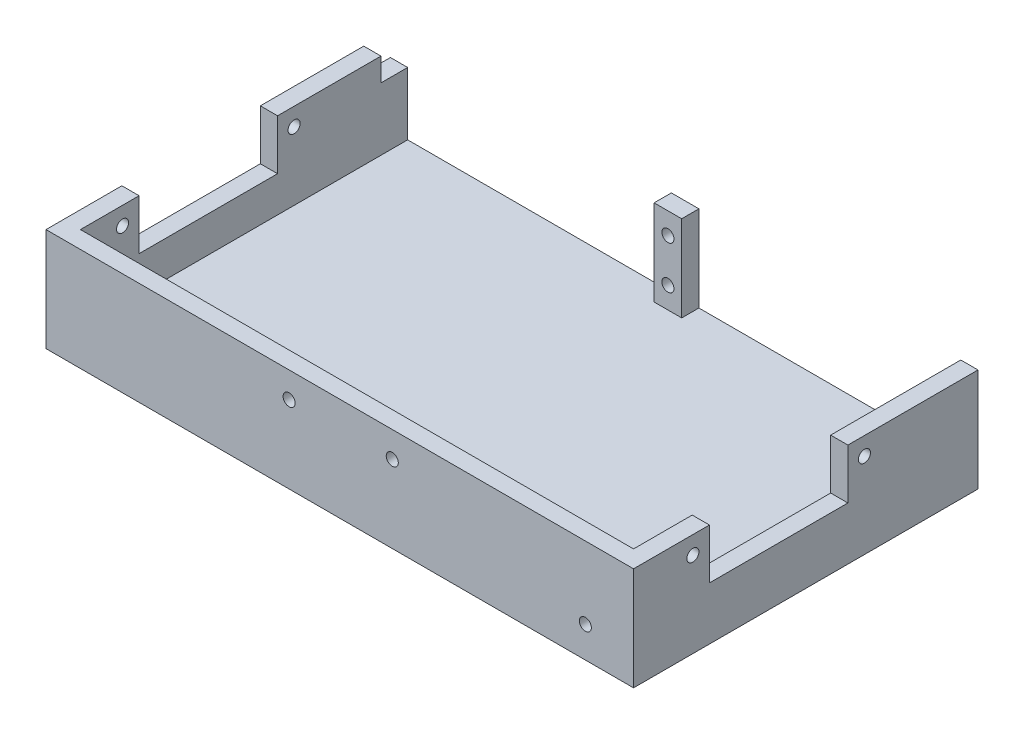
ISO-10303-21;
HEADER;
FILE_DESCRIPTION(('STEP AP214'),'2;1');
FILE_NAME('part.step','',(''),(''),'','','');
FILE_SCHEMA(('AUTOMOTIVE_DESIGN { 1 0 10303 214 1 1 1 1 }'));
ENDSEC;
DATA;
#1=APPLICATION_CONTEXT('core data for automotive mechanical design processes');
#2=APPLICATION_PROTOCOL_DEFINITION('international standard','automotive_design',2000,#1);
#3=PRODUCT_CONTEXT('',#1,'mechanical');
#4=PRODUCT('Part','Part','',(#3));
#5=PRODUCT_RELATED_PRODUCT_CATEGORY('part','',(#4));
#6=PRODUCT_DEFINITION_FORMATION('','',#4);
#7=PRODUCT_DEFINITION_CONTEXT('part definition',#1,'design');
#8=PRODUCT_DEFINITION('design','',#6,#7);
#9=PRODUCT_DEFINITION_SHAPE('','',#8);
#10=(LENGTH_UNIT() NAMED_UNIT(*) SI_UNIT(.MILLI.,.METRE.));
#11=(NAMED_UNIT(*) PLANE_ANGLE_UNIT() SI_UNIT($,.RADIAN.));
#12=(NAMED_UNIT(*) SI_UNIT($,.STERADIAN.) SOLID_ANGLE_UNIT());
#13=UNCERTAINTY_MEASURE_WITH_UNIT(LENGTH_MEASURE(1.E-05),#10,'distance_accuracy_value','');
#14=(GEOMETRIC_REPRESENTATION_CONTEXT(3) GLOBAL_UNCERTAINTY_ASSIGNED_CONTEXT((#13)) GLOBAL_UNIT_ASSIGNED_CONTEXT((#10,
#11,#12)) REPRESENTATION_CONTEXT('',''));
#15=CARTESIAN_POINT('',(0.,0.,0.));
#16=DIRECTION('',(0.,0.,1.));
#17=DIRECTION('',(1.,0.,0.));
#18=AXIS2_PLACEMENT_3D('',#15,#16,#17);
#19=CARTESIAN_POINT('',(0.,29.94,0.));
#20=DIRECTION('',(0.,1.,0.));
#21=DIRECTION('',(0.,0.,1.));
#22=AXIS2_PLACEMENT_3D('',#19,#20,#21);
#23=PLANE('',#22);
#24=DIRECTION('',(1.,0.,0.));
#25=VECTOR('',#24,1.);
#26=CARTESIAN_POINT('',(0.,29.94,64.439595486949));
#27=LINE('',#26,#25);
#28=CARTESIAN_POINT('',(-78.83991424,29.94,64.439595486949));
#29=VERTEX_POINT('',#28);
#30=CARTESIAN_POINT('',(-73.83991424,29.94,64.439595486949));
#31=VERTEX_POINT('',#30);
#32=EDGE_CURVE('E44',#29,#31,#27,.T.);
#33=ORIENTED_EDGE('',*,*,#32,.F.);
#34=DIRECTION('',(0.,0.,1.));
#35=VECTOR('',#34,1.);
#36=CARTESIAN_POINT('',(-78.83991424,29.94,0.));
#37=LINE('',#36,#35);
#38=CARTESIAN_POINT('',(-78.83991424,29.94,86.464595486949));
#39=VERTEX_POINT('',#38);
#40=EDGE_CURVE('E203',#29,#39,#37,.T.);
#41=ORIENTED_EDGE('',*,*,#40,.T.);
#42=DIRECTION('',(1.,0.,0.));
#43=VECTOR('',#42,1.);
#44=CARTESIAN_POINT('',(0.,29.94,86.464595486949));
#45=LINE('',#44,#43);
#46=CARTESIAN_POINT('',(91.74008576,29.94,86.464595486949));
#47=VERTEX_POINT('',#46);
#48=EDGE_CURVE('E235',#39,#47,#45,.T.);
#49=ORIENTED_EDGE('',*,*,#48,.T.);
#50=DIRECTION('',(0.,0.,-1.));
#51=VECTOR('',#50,1.);
#52=CARTESIAN_POINT('',(91.74008576,29.94,0.));
#53=LINE('',#52,#51);
#54=CARTESIAN_POINT('',(91.74008576,29.94,64.439595486949));
#55=VERTEX_POINT('',#54);
#56=EDGE_CURVE('E238',#47,#55,#53,.T.);
#57=ORIENTED_EDGE('',*,*,#56,.T.);
#58=CARTESIAN_POINT('',(86.74008576,29.94,64.439595486949));
#59=VERTEX_POINT('',#58);
#60=EDGE_CURVE('E207',#59,#55,#27,.T.);
#61=ORIENTED_EDGE('',*,*,#60,.F.);
#62=DIRECTION('',(0.,0.,1.));
#63=VECTOR('',#62,1.);
#64=CARTESIAN_POINT('',(86.74008576,29.94,0.));
#65=LINE('',#64,#63);
#66=CARTESIAN_POINT('',(86.74008576,29.94,81.464595486949));
#67=VERTEX_POINT('',#66);
#68=EDGE_CURVE('E231',#59,#67,#65,.T.);
#69=ORIENTED_EDGE('',*,*,#68,.T.);
#70=DIRECTION('',(-1.,0.,0.));
#71=VECTOR('',#70,1.);
#72=CARTESIAN_POINT('',(86.74008576,29.94,81.464595486949));
#73=LINE('',#72,#71);
#74=CARTESIAN_POINT('',(-73.83991424,29.94,81.464595486949));
#75=VERTEX_POINT('',#74);
#76=EDGE_CURVE('E396',#67,#75,#73,.T.);
#77=ORIENTED_EDGE('',*,*,#76,.T.);
#78=DIRECTION('',(0.,0.,1.));
#79=VECTOR('',#78,1.);
#80=CARTESIAN_POINT('',(-73.83991424,29.94,0.));
#81=LINE('',#80,#79);
#82=EDGE_CURVE('E206',#31,#75,#81,.T.);
#83=ORIENTED_EDGE('',*,*,#82,.F.);
#84=EDGE_LOOP('',(#33,#41,#49,#57,#61,#69,#77,#83));
#85=FACE_BOUND('',#84,.T.);
#86=ADVANCED_FACE('F35',(#85),#23,.T.);
#87=DIRECTION('',(-1.,0.,0.));
#88=VECTOR('',#87,1.);
#89=CARTESIAN_POINT('',(0.,29.94,24.239595486949));
#90=LINE('',#89,#88);
#91=CARTESIAN_POINT('',(91.74008576,29.94,24.239595486949));
#92=VERTEX_POINT('',#91);
#93=CARTESIAN_POINT('',(86.74008576,29.94,24.239595486949));
#94=VERTEX_POINT('',#93);
#95=EDGE_CURVE('E270',#92,#94,#90,.T.);
#96=ORIENTED_EDGE('',*,*,#95,.F.);
#97=CARTESIAN_POINT('',(91.74008576,29.94,-13.535404513051));
#98=VERTEX_POINT('',#97);
#99=EDGE_CURVE('E237',#92,#98,#53,.T.);
#100=ORIENTED_EDGE('',*,*,#99,.T.);
#101=DIRECTION('',(-1.,0.,0.));
#102=VECTOR('',#101,1.);
#103=CARTESIAN_POINT('',(0.,29.94,-13.535404513051));
#104=LINE('',#103,#102);
#105=CARTESIAN_POINT('',(86.74008576,29.94,-13.535404513051));
#106=VERTEX_POINT('',#105);
#107=EDGE_CURVE('E228',#98,#106,#104,.T.);
#108=ORIENTED_EDGE('',*,*,#107,.T.);
#109=EDGE_CURVE('E232',#106,#94,#65,.T.);
#110=ORIENTED_EDGE('',*,*,#109,.T.);
#111=EDGE_LOOP('',(#96,#100,#108,#110));
#112=FACE_BOUND('',#111,.T.);
#113=ADVANCED_FACE('F454',(#112),#23,.T.);
#114=CARTESIAN_POINT('',(0.,5.,0.));
#115=DIRECTION('',(0.,1.,0.));
#116=DIRECTION('',(0.,0.,1.));
#117=AXIS2_PLACEMENT_3D('',#114,#115,#116);
#118=PLANE('',#117);
#119=DIRECTION('',(1.,0.,0.));
#120=VECTOR('',#119,1.);
#121=CARTESIAN_POINT('',(10.7150857590685,5.,-8.53540451305102));
#122=LINE('',#121,#120);
#123=CARTESIAN_POINT('',(2.71508575906845,5.,-8.53540451305102));
#124=VERTEX_POINT('',#123);
#125=CARTESIAN_POINT('',(10.7150857590685,5.,-8.53540451305102));
#126=VERTEX_POINT('',#125);
#127=EDGE_CURVE('E379',#124,#126,#122,.T.);
#128=ORIENTED_EDGE('',*,*,#127,.F.);
#129=DIRECTION('',(0.,0.,1.));
#130=VECTOR('',#129,1.);
#131=CARTESIAN_POINT('',(2.71508575906845,5.,-8.53540451305102));
#132=LINE('',#131,#130);
#133=CARTESIAN_POINT('',(2.71508575906845,5.,-13.535404513051));
#134=VERTEX_POINT('',#133);
#135=EDGE_CURVE('E366',#134,#124,#132,.T.);
#136=ORIENTED_EDGE('',*,*,#135,.F.);
#137=DIRECTION('',(-1.,0.,0.));
#138=VECTOR('',#137,1.);
#139=CARTESIAN_POINT('',(-78.83991424,5.,-13.535404513051));
#140=LINE('',#139,#138);
#141=CARTESIAN_POINT('',(-73.83991424,5.,-13.535404513051));
#142=VERTEX_POINT('',#141);
#143=EDGE_CURVE('E250',#134,#142,#140,.T.);
#144=ORIENTED_EDGE('',*,*,#143,.T.);
#145=DIRECTION('',(0.,0.,1.));
#146=VECTOR('',#145,1.);
#147=CARTESIAN_POINT('',(-73.83991424,5.,0.));
#148=LINE('',#147,#146);
#149=CARTESIAN_POINT('',(-73.83991424,5.,81.464595486949));
#150=VERTEX_POINT('',#149);
#151=EDGE_CURVE('E222',#142,#150,#148,.T.);
#152=ORIENTED_EDGE('',*,*,#151,.T.);
#153=DIRECTION('',(-1.,0.,0.));
#154=VECTOR('',#153,1.);
#155=CARTESIAN_POINT('',(86.74008576,5.,81.464595486949));
#156=LINE('',#155,#154);
#157=CARTESIAN_POINT('',(86.74008576,5.,81.464595486949));
#158=VERTEX_POINT('',#157);
#159=EDGE_CURVE('E395',#158,#150,#156,.T.);
#160=ORIENTED_EDGE('',*,*,#159,.F.);
#161=DIRECTION('',(0.,0.,1.));
#162=VECTOR('',#161,1.);
#163=CARTESIAN_POINT('',(86.74008576,5.,0.));
#164=LINE('',#163,#162);
#165=CARTESIAN_POINT('',(86.74008576,5.,-13.535404513051));
#166=VERTEX_POINT('',#165);
#167=EDGE_CURVE('E227',#166,#158,#164,.T.);
#168=ORIENTED_EDGE('',*,*,#167,.F.);
#169=CARTESIAN_POINT('',(10.7150857590685,5.,-13.535404513051));
#170=VERTEX_POINT('',#169);
#171=EDGE_CURVE('E247',#166,#170,#140,.T.);
#172=ORIENTED_EDGE('',*,*,#171,.T.);
#173=DIRECTION('',(0.,0.,-1.));
#174=VECTOR('',#173,1.);
#175=CARTESIAN_POINT('',(10.7150857590685,5.,-13.535404513051));
#176=LINE('',#175,#174);
#177=EDGE_CURVE('E370',#126,#170,#176,.T.);
#178=ORIENTED_EDGE('',*,*,#177,.F.);
#179=EDGE_LOOP('',(#128,#136,#144,#152,#160,#168,#172,#178));
#180=FACE_BOUND('',#179,.T.);
#181=ADVANCED_FACE('F413',(#180),#118,.T.);
#182=CARTESIAN_POINT('',(86.74008576,29.94,0.));
#183=DIRECTION('',(1.,0.,0.));
#184=DIRECTION('',(0.,0.,-1.));
#185=AXIS2_PLACEMENT_3D('',#182,#183,#184);
#186=PLANE('',#185);
#187=CARTESIAN_POINT('',(86.74008576,24.7500000000059,19.4395955400394));
#188=DIRECTION('',(1.,0.,0.));
#189=DIRECTION('',(0.,0.,-1.));
#190=AXIS2_PLACEMENT_3D('',#187,#188,#189);
#191=CIRCLE('',#190,1.75);
#192=CARTESIAN_POINT('',(86.74008576,24.7500000000059,17.6895955400394));
#193=VERTEX_POINT('',#192);
#194=EDGE_CURVE('E305',#193,#193,#191,.T.);
#195=ORIENTED_EDGE('',*,*,#194,.T.);
#196=EDGE_LOOP('',(#195));
#197=FACE_BOUND('',#196,.T.);
#198=CARTESIAN_POINT('',(86.74008576,24.7500000000052,69.2395955400386));
#199=DIRECTION('',(1.,0.,0.));
#200=DIRECTION('',(0.,0.,-1.));
#201=AXIS2_PLACEMENT_3D('',#198,#199,#200);
#202=CIRCLE('',#201,1.75);
#203=CARTESIAN_POINT('',(86.74008576,24.7500000000052,67.4895955400386));
#204=VERTEX_POINT('',#203);
#205=EDGE_CURVE('E198',#204,#204,#202,.T.);
#206=ORIENTED_EDGE('',*,*,#205,.T.);
#207=EDGE_LOOP('',(#206));
#208=FACE_BOUND('',#207,.T.);
#209=ORIENTED_EDGE('',*,*,#68,.F.);
#210=DIRECTION('',(0.,-1.,0.));
#211=VECTOR('',#210,1.);
#212=CARTESIAN_POINT('',(86.74008576,29.94,64.439595486949));
#213=LINE('',#212,#211);
#214=CARTESIAN_POINT('',(86.74008576,15.375,64.439595486949));
#215=VERTEX_POINT('',#214);
#216=EDGE_CURVE('E333',#59,#215,#213,.T.);
#217=ORIENTED_EDGE('',*,*,#216,.T.);
#218=DIRECTION('',(0.,0.,-1.));
#219=VECTOR('',#218,1.);
#220=CARTESIAN_POINT('',(86.74008576,15.375,0.));
#221=LINE('',#220,#219);
#222=CARTESIAN_POINT('',(86.74008576,15.375,24.239595486949));
#223=VERTEX_POINT('',#222);
#224=EDGE_CURVE('E338',#215,#223,#221,.T.);
#225=ORIENTED_EDGE('',*,*,#224,.T.);
#226=DIRECTION('',(0.,1.,0.));
#227=VECTOR('',#226,1.);
#228=CARTESIAN_POINT('',(86.74008576,29.94,24.239595486949));
#229=LINE('',#228,#227);
#230=EDGE_CURVE('E325',#223,#94,#229,.T.);
#231=ORIENTED_EDGE('',*,*,#230,.T.);
#232=ORIENTED_EDGE('',*,*,#109,.F.);
#233=DIRECTION('',(0.,-1.,0.));
#234=VECTOR('',#233,1.);
#235=CARTESIAN_POINT('',(86.74008576,29.94,-13.535404513051));
#236=LINE('',#235,#234);
#237=EDGE_CURVE('E241',#106,#166,#236,.T.);
#238=ORIENTED_EDGE('',*,*,#237,.T.);
#239=ORIENTED_EDGE('',*,*,#167,.T.);
#240=DIRECTION('',(0.,-1.,0.));
#241=VECTOR('',#240,1.);
#242=CARTESIAN_POINT('',(86.74008576,29.94,81.464595486949));
#243=LINE('',#242,#241);
#244=EDGE_CURVE('E225',#67,#158,#243,.T.);
#245=ORIENTED_EDGE('',*,*,#244,.F.);
#246=EDGE_LOOP('',(#209,#217,#225,#231,#232,#238,#239,#245));
#247=FACE_BOUND('',#246,.T.);
#248=ADVANCED_FACE('F409',(#197,#208,#247),#186,.F.);
#249=CARTESIAN_POINT('',(-73.83991424,29.94,0.));
#250=DIRECTION('',(1.,0.,0.));
#251=DIRECTION('',(0.,0.,-1.));
#252=AXIS2_PLACEMENT_3D('',#249,#250,#251);
#253=PLANE('',#252);
#254=CARTESIAN_POINT('',(-73.83991424,24.7500000000059,19.4395955400394));
#255=DIRECTION('',(1.,0.,0.));
#256=DIRECTION('',(0.,0.,-1.));
#257=AXIS2_PLACEMENT_3D('',#254,#255,#256);
#258=CIRCLE('',#257,1.75);
#259=CARTESIAN_POINT('',(-73.83991424,24.7500000000059,17.6895955400394));
#260=VERTEX_POINT('',#259);
#261=EDGE_CURVE('E280',#260,#260,#258,.T.);
#262=ORIENTED_EDGE('',*,*,#261,.F.);
#263=EDGE_LOOP('',(#262));
#264=FACE_BOUND('',#263,.T.);
#265=CARTESIAN_POINT('',(-73.83991424,24.7500000000052,69.2395955400386));
#266=DIRECTION('',(1.,0.,0.));
#267=DIRECTION('',(0.,0.,-1.));
#268=AXIS2_PLACEMENT_3D('',#265,#266,#267);
#269=CIRCLE('',#268,1.75);
#270=CARTESIAN_POINT('',(-73.83991424,24.7500000000052,67.4895955400386));
#271=VERTEX_POINT('',#270);
#272=EDGE_CURVE('E275',#271,#271,#269,.T.);
#273=ORIENTED_EDGE('',*,*,#272,.F.);
#274=EDGE_LOOP('',(#273));
#275=FACE_BOUND('',#274,.T.);
#276=DIRECTION('',(0.,-1.,0.));
#277=VECTOR('',#276,1.);
#278=CARTESIAN_POINT('',(-73.83991424,29.94,64.439595486949));
#279=LINE('',#278,#277);
#280=CARTESIAN_POINT('',(-73.83991424,15.375,64.439595486949));
#281=VERTEX_POINT('',#280);
#282=EDGE_CURVE('E331',#31,#281,#279,.T.);
#283=ORIENTED_EDGE('',*,*,#282,.F.);
#284=ORIENTED_EDGE('',*,*,#82,.T.);
#285=DIRECTION('',(0.,-1.,0.));
#286=VECTOR('',#285,1.);
#287=CARTESIAN_POINT('',(-73.83991424,29.94,81.464595486949));
#288=LINE('',#287,#286);
#289=EDGE_CURVE('E398',#75,#150,#288,.T.);
#290=ORIENTED_EDGE('',*,*,#289,.T.);
#291=ORIENTED_EDGE('',*,*,#151,.F.);
#292=DIRECTION('',(0.,-1.,0.));
#293=VECTOR('',#292,1.);
#294=CARTESIAN_POINT('',(-73.83991424,29.94,-13.535404513051));
#295=LINE('',#294,#293);
#296=CARTESIAN_POINT('',(-73.83991424,23.2,-13.535404513051));
#297=VERTEX_POINT('',#296);
#298=EDGE_CURVE('E217',#297,#142,#295,.T.);
#299=ORIENTED_EDGE('',*,*,#298,.F.);
#300=DIRECTION('',(0.,0.,-1.));
#301=VECTOR('',#300,1.);
#302=CARTESIAN_POINT('',(-73.83991424,23.2,0.));
#303=LINE('',#302,#301);
#304=CARTESIAN_POINT('',(-73.83991424,23.2,-5.78540451305102));
#305=VERTEX_POINT('',#304);
#306=EDGE_CURVE('E352',#305,#297,#303,.T.);
#307=ORIENTED_EDGE('',*,*,#306,.F.);
#308=DIRECTION('',(0.,-1.,0.));
#309=VECTOR('',#308,1.);
#310=CARTESIAN_POINT('',(-73.83991424,29.94,-5.78540451305102));
#311=LINE('',#310,#309);
#312=CARTESIAN_POINT('',(-73.83991424,29.94,-5.78540451305102));
#313=VERTEX_POINT('',#312);
#314=EDGE_CURVE('E349',#313,#305,#311,.T.);
#315=ORIENTED_EDGE('',*,*,#314,.F.);
#316=CARTESIAN_POINT('',(-73.83991424,29.94,24.239595486949));
#317=VERTEX_POINT('',#316);
#318=EDGE_CURVE('E214',#313,#317,#81,.T.);
#319=ORIENTED_EDGE('',*,*,#318,.T.);
#320=DIRECTION('',(0.,1.,0.));
#321=VECTOR('',#320,1.);
#322=CARTESIAN_POINT('',(-73.83991424,29.94,24.239595486949));
#323=LINE('',#322,#321);
#324=CARTESIAN_POINT('',(-73.83991424,15.375,24.239595486949));
#325=VERTEX_POINT('',#324);
#326=EDGE_CURVE('E52',#325,#317,#323,.T.);
#327=ORIENTED_EDGE('',*,*,#326,.F.);
#328=DIRECTION('',(0.,0.,-1.));
#329=VECTOR('',#328,1.);
#330=CARTESIAN_POINT('',(-73.83991424,15.375,0.));
#331=LINE('',#330,#329);
#332=EDGE_CURVE('E336',#281,#325,#331,.T.);
#333=ORIENTED_EDGE('',*,*,#332,.F.);
#334=EDGE_LOOP('',(#283,#284,#290,#291,#299,#307,#315,#319,#327,#333));
#335=FACE_BOUND('',#334,.T.);
#336=ADVANCED_FACE('F437',(#264,#275,#335),#253,.T.);
#337=CARTESIAN_POINT('',(-78.83991424,5.,-13.535404513051));
#338=DIRECTION('',(1.,0.,0.));
#339=DIRECTION('',(0.,0.,-1.));
#340=AXIS2_PLACEMENT_3D('',#337,#338,#339);
#341=PLANE('',#340);
#342=CARTESIAN_POINT('',(-78.83991424,24.7500000000059,19.4395955400394));
#343=DIRECTION('',(-1.,0.,0.));
#344=DIRECTION('',(0.,0.,1.));
#345=AXIS2_PLACEMENT_3D('',#342,#343,#344);
#346=CIRCLE('',#345,1.75);
#347=CARTESIAN_POINT('',(-78.83991424,24.7500000000059,21.1895955400394));
#348=VERTEX_POINT('',#347);
#349=EDGE_CURVE('E281',#348,#348,#346,.T.);
#350=ORIENTED_EDGE('',*,*,#349,.F.);
#351=EDGE_LOOP('',(#350));
#352=FACE_BOUND('',#351,.T.);
#353=CARTESIAN_POINT('',(-78.83991424,24.7500000000052,69.2395955400386));
#354=DIRECTION('',(-1.,0.,0.));
#355=DIRECTION('',(0.,0.,1.));
#356=AXIS2_PLACEMENT_3D('',#353,#354,#355);
#357=CIRCLE('',#356,1.75);
#358=CARTESIAN_POINT('',(-78.83991424,24.7500000000052,70.9895955400386));
#359=VERTEX_POINT('',#358);
#360=EDGE_CURVE('E276',#359,#359,#357,.T.);
#361=ORIENTED_EDGE('',*,*,#360,.F.);
#362=EDGE_LOOP('',(#361));
#363=FACE_BOUND('',#362,.T.);
#364=ORIENTED_EDGE('',*,*,#40,.F.);
#365=DIRECTION('',(0.,1.,0.));
#366=VECTOR('',#365,1.);
#367=CARTESIAN_POINT('',(-78.83991424,15.375,64.439595486949));
#368=LINE('',#367,#366);
#369=CARTESIAN_POINT('',(-78.83991424,15.375,64.439595486949));
#370=VERTEX_POINT('',#369);
#371=EDGE_CURVE('E187',#370,#29,#368,.T.);
#372=ORIENTED_EDGE('',*,*,#371,.F.);
#373=DIRECTION('',(0.,0.,1.));
#374=VECTOR('',#373,1.);
#375=CARTESIAN_POINT('',(-78.83991424,15.375,24.239595486949));
#376=LINE('',#375,#374);
#377=CARTESIAN_POINT('',(-78.83991424,15.375,24.239595486949));
#378=VERTEX_POINT('',#377);
#379=EDGE_CURVE('E316',#378,#370,#376,.T.);
#380=ORIENTED_EDGE('',*,*,#379,.F.);
#381=DIRECTION('',(0.,-1.,0.));
#382=VECTOR('',#381,1.);
#383=CARTESIAN_POINT('',(-78.83991424,29.94,24.239595486949));
#384=LINE('',#383,#382);
#385=CARTESIAN_POINT('',(-78.83991424,29.94,24.239595486949));
#386=VERTEX_POINT('',#385);
#387=EDGE_CURVE('E197',#386,#378,#384,.T.);
#388=ORIENTED_EDGE('',*,*,#387,.F.);
#389=CARTESIAN_POINT('',(-78.83991424,29.94,-5.78540451305102));
#390=VERTEX_POINT('',#389);
#391=EDGE_CURVE('E213',#390,#386,#37,.T.);
#392=ORIENTED_EDGE('',*,*,#391,.F.);
#393=DIRECTION('',(0.,1.,0.));
#394=VECTOR('',#393,1.);
#395=CARTESIAN_POINT('',(-78.83991424,23.2,-5.78540451305102));
#396=LINE('',#395,#394);
#397=CARTESIAN_POINT('',(-78.83991424,23.2,-5.78540451305102));
#398=VERTEX_POINT('',#397);
#399=EDGE_CURVE('E344',#398,#390,#396,.T.);
#400=ORIENTED_EDGE('',*,*,#399,.F.);
#401=DIRECTION('',(0.,0.,1.));
#402=VECTOR('',#401,1.);
#403=CARTESIAN_POINT('',(-78.83991424,23.2,-13.535404513051));
#404=LINE('',#403,#402);
#405=CARTESIAN_POINT('',(-78.83991424,23.2,-13.535404513051));
#406=VERTEX_POINT('',#405);
#407=EDGE_CURVE('E341',#406,#398,#404,.T.);
#408=ORIENTED_EDGE('',*,*,#407,.F.);
#409=DIRECTION('',(0.,-1.,0.));
#410=VECTOR('',#409,1.);
#411=CARTESIAN_POINT('',(-78.83991424,5.,-13.535404513051));
#412=LINE('',#411,#410);
#413=CARTESIAN_POINT('',(-78.83991424,0.,-13.535404513051));
#414=VERTEX_POINT('',#413);
#415=EDGE_CURVE('E249',#406,#414,#412,.T.);
#416=ORIENTED_EDGE('',*,*,#415,.T.);
#417=DIRECTION('',(0.,0.,1.));
#418=VECTOR('',#417,1.);
#419=CARTESIAN_POINT('',(-78.83991424,0.,-13.535404513051));
#420=LINE('',#419,#418);
#421=CARTESIAN_POINT('',(-78.83991424,0.,86.464595486949));
#422=VERTEX_POINT('',#421);
#423=EDGE_CURVE('E246',#414,#422,#420,.T.);
#424=ORIENTED_EDGE('',*,*,#423,.T.);
#425=DIRECTION('',(0.,-1.,0.));
#426=VECTOR('',#425,1.);
#427=CARTESIAN_POINT('',(-78.83991424,5.,86.464595486949));
#428=LINE('',#427,#426);
#429=EDGE_CURVE('E212',#39,#422,#428,.T.);
#430=ORIENTED_EDGE('',*,*,#429,.F.);
#431=EDGE_LOOP('',(#364,#372,#380,#388,#392,#400,#408,#416,#424,#430));
#432=FACE_BOUND('',#431,.T.);
#433=ADVANCED_FACE('F37',(#352,#363,#432),#341,.F.);
#434=CARTESIAN_POINT('',(-78.83991424,5.,86.464595486949));
#435=DIRECTION('',(0.,0.,-1.));
#436=DIRECTION('',(-1.,0.,0.));
#437=AXIS2_PLACEMENT_3D('',#434,#435,#436);
#438=PLANE('',#437);
#439=CARTESIAN_POINT('',(-8.25207946889377,22.44,86.464595486949));
#440=DIRECTION('',(0.,0.,1.));
#441=DIRECTION('',(1.,0.,0.));
#442=AXIS2_PLACEMENT_3D('',#439,#440,#441);
#443=CIRCLE('',#442,1.75);
#444=CARTESIAN_POINT('',(-6.50207946889376,22.44,86.464595486949));
#445=VERTEX_POINT('',#444);
#446=EDGE_CURVE('E287',#445,#445,#443,.T.);
#447=ORIENTED_EDGE('',*,*,#446,.F.);
#448=EDGE_LOOP('',(#447));
#449=FACE_BOUND('',#448,.T.);
#450=CARTESIAN_POINT('',(77.74008576,9.,86.464595486949));
#451=DIRECTION('',(0.,0.,1.));
#452=DIRECTION('',(1.,0.,0.));
#453=AXIS2_PLACEMENT_3D('',#450,#451,#452);
#454=CIRCLE('',#453,1.75);
#455=CARTESIAN_POINT('',(79.49008576,9.,86.464595486949));
#456=VERTEX_POINT('',#455);
#457=EDGE_CURVE('E292',#456,#456,#454,.T.);
#458=ORIENTED_EDGE('',*,*,#457,.F.);
#459=EDGE_LOOP('',(#458));
#460=FACE_BOUND('',#459,.T.);
#461=CARTESIAN_POINT('',(21.6879205311062,22.44,86.464595486949));
#462=DIRECTION('',(0.,0.,1.));
#463=DIRECTION('',(1.,0.,0.));
#464=AXIS2_PLACEMENT_3D('',#461,#462,#463);
#465=CIRCLE('',#464,1.75);
#466=CARTESIAN_POINT('',(23.4379205311062,22.44,86.464595486949));
#467=VERTEX_POINT('',#466);
#468=EDGE_CURVE('E284',#467,#467,#465,.T.);
#469=ORIENTED_EDGE('',*,*,#468,.F.);
#470=EDGE_LOOP('',(#469));
#471=FACE_BOUND('',#470,.T.);
#472=DIRECTION('',(1.,0.,0.));
#473=VECTOR('',#472,1.);
#474=CARTESIAN_POINT('',(-78.83991424,0.,86.464595486949));
#475=LINE('',#474,#473);
#476=CARTESIAN_POINT('',(91.74008576,0.,86.464595486949));
#477=VERTEX_POINT('',#476);
#478=EDGE_CURVE('E252',#422,#477,#475,.T.);
#479=ORIENTED_EDGE('',*,*,#478,.T.);
#480=DIRECTION('',(0.,-1.,0.));
#481=VECTOR('',#480,1.);
#482=CARTESIAN_POINT('',(91.74008576,5.,86.464595486949));
#483=LINE('',#482,#481);
#484=EDGE_CURVE('E263',#47,#477,#483,.T.);
#485=ORIENTED_EDGE('',*,*,#484,.F.);
#486=ORIENTED_EDGE('',*,*,#48,.F.);
#487=ORIENTED_EDGE('',*,*,#429,.T.);
#488=EDGE_LOOP('',(#479,#485,#486,#487));
#489=FACE_BOUND('',#488,.T.);
#490=ADVANCED_FACE('F510',(#449,#460,#471,#489),#438,.F.);
#491=CARTESIAN_POINT('',(91.74008576,5.,-13.535404513051));
#492=DIRECTION('',(-1.,0.,0.));
#493=DIRECTION('',(0.,0.,1.));
#494=AXIS2_PLACEMENT_3D('',#491,#492,#493);
#495=PLANE('',#494);
#496=CARTESIAN_POINT('',(91.74008576,24.7500000000059,19.4395955400394));
#497=DIRECTION('',(-1.,0.,0.));
#498=DIRECTION('',(0.,0.,1.));
#499=AXIS2_PLACEMENT_3D('',#496,#497,#498);
#500=CIRCLE('',#499,1.75);
#501=CARTESIAN_POINT('',(91.74008576,24.7500000000059,21.1895955400394));
#502=VERTEX_POINT('',#501);
#503=EDGE_CURVE('E277',#502,#502,#500,.T.);
#504=ORIENTED_EDGE('',*,*,#503,.T.);
#505=EDGE_LOOP('',(#504));
#506=FACE_BOUND('',#505,.T.);
#507=CARTESIAN_POINT('',(91.74008576,24.7500000000052,69.2395955400386));
#508=DIRECTION('',(-1.,0.,0.));
#509=DIRECTION('',(0.,0.,1.));
#510=AXIS2_PLACEMENT_3D('',#507,#508,#509);
#511=CIRCLE('',#510,1.75);
#512=CARTESIAN_POINT('',(91.74008576,24.7500000000052,70.9895955400386));
#513=VERTEX_POINT('',#512);
#514=EDGE_CURVE('E272',#513,#513,#511,.T.);
#515=ORIENTED_EDGE('',*,*,#514,.T.);
#516=EDGE_LOOP('',(#515));
#517=FACE_BOUND('',#516,.T.);
#518=DIRECTION('',(0.,0.,1.));
#519=VECTOR('',#518,1.);
#520=CARTESIAN_POINT('',(91.74008576,15.375,-13.535404513051));
#521=LINE('',#520,#519);
#522=CARTESIAN_POINT('',(91.74008576,15.375,24.239595486949));
#523=VERTEX_POINT('',#522);
#524=CARTESIAN_POINT('',(91.74008576,15.375,64.439595486949));
#525=VERTEX_POINT('',#524);
#526=EDGE_CURVE('E11',#523,#525,#521,.T.);
#527=ORIENTED_EDGE('',*,*,#526,.T.);
#528=DIRECTION('',(0.,1.,0.));
#529=VECTOR('',#528,1.);
#530=CARTESIAN_POINT('',(91.74008576,5.,64.439595486949));
#531=LINE('',#530,#529);
#532=EDGE_CURVE('E328',#525,#55,#531,.T.);
#533=ORIENTED_EDGE('',*,*,#532,.T.);
#534=ORIENTED_EDGE('',*,*,#56,.F.);
#535=ORIENTED_EDGE('',*,*,#484,.T.);
#536=DIRECTION('',(0.,0.,-1.));
#537=VECTOR('',#536,1.);
#538=CARTESIAN_POINT('',(91.74008576,0.,-13.535404513051));
#539=LINE('',#538,#537);
#540=CARTESIAN_POINT('',(91.74008576,0.,-13.535404513051));
#541=VERTEX_POINT('',#540);
#542=EDGE_CURVE('E254',#477,#541,#539,.T.);
#543=ORIENTED_EDGE('',*,*,#542,.T.);
#544=DIRECTION('',(0.,-1.,0.));
#545=VECTOR('',#544,1.);
#546=CARTESIAN_POINT('',(91.74008576,5.,-13.535404513051));
#547=LINE('',#546,#545);
#548=EDGE_CURVE('E260',#98,#541,#547,.T.);
#549=ORIENTED_EDGE('',*,*,#548,.F.);
#550=ORIENTED_EDGE('',*,*,#99,.F.);
#551=DIRECTION('',(0.,-1.,0.));
#552=VECTOR('',#551,1.);
#553=CARTESIAN_POINT('',(91.74008576,5.,24.239595486949));
#554=LINE('',#553,#552);
#555=EDGE_CURVE('E60',#92,#523,#554,.T.);
#556=ORIENTED_EDGE('',*,*,#555,.T.);
#557=EDGE_LOOP('',(#527,#533,#534,#535,#543,#549,#550,#556));
#558=FACE_BOUND('',#557,.T.);
#559=ADVANCED_FACE('F447',(#506,#517,#558),#495,.F.);
#560=CARTESIAN_POINT('',(-78.83991424,5.,-13.535404513051));
#561=DIRECTION('',(0.,0.,1.));
#562=DIRECTION('',(1.,0.,0.));
#563=AXIS2_PLACEMENT_3D('',#560,#561,#562);
#564=PLANE('',#563);
#565=CARTESIAN_POINT('',(6.71508575906846,23.705,-13.535404513051));
#566=DIRECTION('',(0.,0.,1.));
#567=DIRECTION('',(1.,0.,0.));
#568=AXIS2_PLACEMENT_3D('',#565,#566,#567);
#569=CIRCLE('',#568,1.75);
#570=CARTESIAN_POINT('',(8.46508575906846,23.705,-13.535404513051));
#571=VERTEX_POINT('',#570);
#572=EDGE_CURVE('E357',#571,#571,#569,.T.);
#573=ORIENTED_EDGE('',*,*,#572,.T.);
#574=EDGE_LOOP('',(#573));
#575=FACE_BOUND('',#574,.T.);
#576=CARTESIAN_POINT('',(6.71508575906846,11.235,-13.535404513051));
#577=DIRECTION('',(0.,0.,1.));
#578=DIRECTION('',(1.,0.,0.));
#579=AXIS2_PLACEMENT_3D('',#576,#577,#578);
#580=CIRCLE('',#579,1.75);
#581=CARTESIAN_POINT('',(8.46508575906846,11.235,-13.535404513051));
#582=VERTEX_POINT('',#581);
#583=EDGE_CURVE('E363',#582,#582,#580,.T.);
#584=ORIENTED_EDGE('',*,*,#583,.T.);
#585=EDGE_LOOP('',(#584));
#586=FACE_BOUND('',#585,.T.);
#587=ORIENTED_EDGE('',*,*,#415,.F.);
#588=DIRECTION('',(-1.,0.,0.));
#589=VECTOR('',#588,1.);
#590=CARTESIAN_POINT('',(-68.83991424,23.2,-13.535404513051));
#591=LINE('',#590,#589);
#592=EDGE_CURVE('E346',#297,#406,#591,.T.);
#593=ORIENTED_EDGE('',*,*,#592,.F.);
#594=ORIENTED_EDGE('',*,*,#298,.T.);
#595=ORIENTED_EDGE('',*,*,#143,.F.);
#596=DIRECTION('',(0.,-1.,0.));
#597=VECTOR('',#596,1.);
#598=CARTESIAN_POINT('',(2.71508575906845,29.94,-13.535404513051));
#599=LINE('',#598,#597);
#600=CARTESIAN_POINT('',(2.71508575906845,29.94,-13.535404513051));
#601=VERTEX_POINT('',#600);
#602=EDGE_CURVE('E392',#601,#134,#599,.T.);
#603=ORIENTED_EDGE('',*,*,#602,.F.);
#604=DIRECTION('',(-1.,0.,0.));
#605=VECTOR('',#604,1.);
#606=CARTESIAN_POINT('',(6.45008576,29.94,-13.535404513051));
#607=LINE('',#606,#605);
#608=CARTESIAN_POINT('',(10.7150857590685,29.94,-13.535404513051));
#609=VERTEX_POINT('',#608);
#610=EDGE_CURVE('E367',#609,#601,#607,.T.);
#611=ORIENTED_EDGE('',*,*,#610,.F.);
#612=DIRECTION('',(0.,-1.,0.));
#613=VECTOR('',#612,1.);
#614=CARTESIAN_POINT('',(10.7150857590685,29.94,-13.535404513051));
#615=LINE('',#614,#613);
#616=EDGE_CURVE('E376',#609,#170,#615,.T.);
#617=ORIENTED_EDGE('',*,*,#616,.T.);
#618=ORIENTED_EDGE('',*,*,#171,.F.);
#619=ORIENTED_EDGE('',*,*,#237,.F.);
#620=ORIENTED_EDGE('',*,*,#107,.F.);
#621=ORIENTED_EDGE('',*,*,#548,.T.);
#622=DIRECTION('',(-1.,0.,0.));
#623=VECTOR('',#622,1.);
#624=CARTESIAN_POINT('',(-78.83991424,0.,-13.535404513051));
#625=LINE('',#624,#623);
#626=EDGE_CURVE('E256',#541,#414,#625,.T.);
#627=ORIENTED_EDGE('',*,*,#626,.T.);
#628=EDGE_LOOP('',(#587,#593,#594,#595,#603,#611,#617,#618,#619,#620,#621,#627));
#629=FACE_BOUND('',#628,.T.);
#630=ADVANCED_FACE('F416',(#575,#586,#629),#564,.F.);
#631=CARTESIAN_POINT('',(0.,0.,0.));
#632=DIRECTION('',(0.,1.,0.));
#633=DIRECTION('',(0.,0.,1.));
#634=AXIS2_PLACEMENT_3D('',#631,#632,#633);
#635=PLANE('',#634);
#636=ORIENTED_EDGE('',*,*,#423,.F.);
#637=ORIENTED_EDGE('',*,*,#626,.F.);
#638=ORIENTED_EDGE('',*,*,#542,.F.);
#639=ORIENTED_EDGE('',*,*,#478,.F.);
#640=EDGE_LOOP('',(#636,#637,#638,#639));
#641=FACE_BOUND('',#640,.T.);
#642=ADVANCED_FACE('F460',(#641),#635,.F.);
#643=EDGE_CURVE('E269',#317,#386,#90,.T.);
#644=ORIENTED_EDGE('',*,*,#643,.F.);
#645=ORIENTED_EDGE('',*,*,#318,.F.);
#646=DIRECTION('',(1.,0.,0.));
#647=VECTOR('',#646,1.);
#648=CARTESIAN_POINT('',(0.,29.94,-5.78540451305102));
#649=LINE('',#648,#647);
#650=EDGE_CURVE('E267',#390,#313,#649,.T.);
#651=ORIENTED_EDGE('',*,*,#650,.F.);
#652=ORIENTED_EDGE('',*,*,#391,.T.);
#653=EDGE_LOOP('',(#644,#645,#651,#652));
#654=FACE_BOUND('',#653,.T.);
#655=ADVANCED_FACE('F472',(#654),#23,.T.);
#656=CARTESIAN_POINT('',(86.74008576,29.94,81.464595486949));
#657=DIRECTION('',(0.,0.,1.));
#658=DIRECTION('',(1.,0.,0.));
#659=AXIS2_PLACEMENT_3D('',#656,#657,#658);
#660=PLANE('',#659);
#661=CARTESIAN_POINT('',(-8.25207946889377,22.44,81.464595486949));
#662=DIRECTION('',(0.,0.,1.));
#663=DIRECTION('',(1.,0.,0.));
#664=AXIS2_PLACEMENT_3D('',#661,#662,#663);
#665=CIRCLE('',#664,1.75);
#666=CARTESIAN_POINT('',(-6.50207946889376,22.44,81.464595486949));
#667=VERTEX_POINT('',#666);
#668=EDGE_CURVE('E39',#667,#667,#665,.T.);
#669=ORIENTED_EDGE('',*,*,#668,.T.);
#670=EDGE_LOOP('',(#669));
#671=FACE_BOUND('',#670,.T.);
#672=CARTESIAN_POINT('',(77.74008576,9.,81.464595486949));
#673=DIRECTION('',(0.,0.,1.));
#674=DIRECTION('',(1.,0.,0.));
#675=AXIS2_PLACEMENT_3D('',#672,#673,#674);
#676=CIRCLE('',#675,1.75);
#677=CARTESIAN_POINT('',(79.49008576,9.,81.464595486949));
#678=VERTEX_POINT('',#677);
#679=EDGE_CURVE('E285',#678,#678,#676,.T.);
#680=ORIENTED_EDGE('',*,*,#679,.T.);
#681=EDGE_LOOP('',(#680));
#682=FACE_BOUND('',#681,.T.);
#683=CARTESIAN_POINT('',(21.6879205311062,22.44,81.464595486949));
#684=DIRECTION('',(0.,0.,1.));
#685=DIRECTION('',(1.,0.,0.));
#686=AXIS2_PLACEMENT_3D('',#683,#684,#685);
#687=CIRCLE('',#686,1.75);
#688=CARTESIAN_POINT('',(23.4379205311062,22.44,81.464595486949));
#689=VERTEX_POINT('',#688);
#690=EDGE_CURVE('E282',#689,#689,#687,.T.);
#691=ORIENTED_EDGE('',*,*,#690,.T.);
#692=EDGE_LOOP('',(#691));
#693=FACE_BOUND('',#692,.T.);
#694=ORIENTED_EDGE('',*,*,#159,.T.);
#695=ORIENTED_EDGE('',*,*,#289,.F.);
#696=ORIENTED_EDGE('',*,*,#76,.F.);
#697=ORIENTED_EDGE('',*,*,#244,.T.);
#698=EDGE_LOOP('',(#694,#695,#696,#697));
#699=FACE_BOUND('',#698,.T.);
#700=ADVANCED_FACE('F405',(#671,#682,#693,#699),#660,.F.);
#701=CARTESIAN_POINT('',(2.71508575906845,29.94,-8.53540451305102));
#702=DIRECTION('',(1.,0.,0.));
#703=DIRECTION('',(0.,0.,-1.));
#704=AXIS2_PLACEMENT_3D('',#701,#702,#703);
#705=PLANE('',#704);
#706=ORIENTED_EDGE('',*,*,#135,.T.);
#707=DIRECTION('',(0.,-1.,0.));
#708=VECTOR('',#707,1.);
#709=CARTESIAN_POINT('',(2.71508575906845,29.94,-8.53540451305102));
#710=LINE('',#709,#708);
#711=CARTESIAN_POINT('',(2.71508575906845,29.94,-8.53540451305102));
#712=VERTEX_POINT('',#711);
#713=EDGE_CURVE('E389',#712,#124,#710,.T.);
#714=ORIENTED_EDGE('',*,*,#713,.F.);
#715=DIRECTION('',(0.,0.,1.));
#716=VECTOR('',#715,1.);
#717=CARTESIAN_POINT('',(2.71508575906845,29.94,-8.53540451305102));
#718=LINE('',#717,#716);
#719=EDGE_CURVE('E369',#601,#712,#718,.T.);
#720=ORIENTED_EDGE('',*,*,#719,.F.);
#721=ORIENTED_EDGE('',*,*,#602,.T.);
#722=EDGE_LOOP('',(#706,#714,#720,#721));
#723=FACE_BOUND('',#722,.T.);
#724=ADVANCED_FACE('F432',(#723),#705,.F.);
#725=CARTESIAN_POINT('',(10.7150857590685,29.94,-8.53540451305102));
#726=DIRECTION('',(0.,0.,-1.));
#727=DIRECTION('',(-1.,0.,0.));
#728=AXIS2_PLACEMENT_3D('',#725,#726,#727);
#729=PLANE('',#728);
#730=CARTESIAN_POINT('',(6.71508575906846,23.705,-8.53540451305102));
#731=DIRECTION('',(0.,0.,1.));
#732=DIRECTION('',(1.,0.,0.));
#733=AXIS2_PLACEMENT_3D('',#730,#731,#732);
#734=CIRCLE('',#733,1.75);
#735=CARTESIAN_POINT('',(8.46508575906846,23.705,-8.53540451305102));
#736=VERTEX_POINT('',#735);
#737=EDGE_CURVE('E354',#736,#736,#734,.T.);
#738=ORIENTED_EDGE('',*,*,#737,.F.);
#739=EDGE_LOOP('',(#738));
#740=FACE_BOUND('',#739,.T.);
#741=CARTESIAN_POINT('',(6.71508575906846,11.235,-8.53540451305102));
#742=DIRECTION('',(0.,0.,1.));
#743=DIRECTION('',(1.,0.,0.));
#744=AXIS2_PLACEMENT_3D('',#741,#742,#743);
#745=CIRCLE('',#744,1.75);
#746=CARTESIAN_POINT('',(8.46508575906846,11.235,-8.53540451305102));
#747=VERTEX_POINT('',#746);
#748=EDGE_CURVE('E360',#747,#747,#745,.T.);
#749=ORIENTED_EDGE('',*,*,#748,.F.);
#750=EDGE_LOOP('',(#749));
#751=FACE_BOUND('',#750,.T.);
#752=ORIENTED_EDGE('',*,*,#127,.T.);
#753=DIRECTION('',(0.,-1.,0.));
#754=VECTOR('',#753,1.);
#755=CARTESIAN_POINT('',(10.7150857590685,29.94,-8.53540451305102));
#756=LINE('',#755,#754);
#757=CARTESIAN_POINT('',(10.7150857590685,29.94,-8.53540451305102));
#758=VERTEX_POINT('',#757);
#759=EDGE_CURVE('E386',#758,#126,#756,.T.);
#760=ORIENTED_EDGE('',*,*,#759,.F.);
#761=DIRECTION('',(1.,0.,0.));
#762=VECTOR('',#761,1.);
#763=CARTESIAN_POINT('',(10.7150857590685,29.94,-8.53540451305102));
#764=LINE('',#763,#762);
#765=EDGE_CURVE('E372',#712,#758,#764,.T.);
#766=ORIENTED_EDGE('',*,*,#765,.F.);
#767=ORIENTED_EDGE('',*,*,#713,.T.);
#768=EDGE_LOOP('',(#752,#760,#766,#767));
#769=FACE_BOUND('',#768,.T.);
#770=ADVANCED_FACE('F427',(#740,#751,#769),#729,.F.);
#771=CARTESIAN_POINT('',(10.7150857590685,29.94,-13.535404513051));
#772=DIRECTION('',(-1.,0.,0.));
#773=DIRECTION('',(0.,0.,1.));
#774=AXIS2_PLACEMENT_3D('',#771,#772,#773);
#775=PLANE('',#774);
#776=ORIENTED_EDGE('',*,*,#177,.T.);
#777=ORIENTED_EDGE('',*,*,#616,.F.);
#778=DIRECTION('',(0.,0.,-1.));
#779=VECTOR('',#778,1.);
#780=CARTESIAN_POINT('',(10.7150857590685,29.94,-13.535404513051));
#781=LINE('',#780,#779);
#782=EDGE_CURVE('E374',#758,#609,#781,.T.);
#783=ORIENTED_EDGE('',*,*,#782,.F.);
#784=ORIENTED_EDGE('',*,*,#759,.T.);
#785=EDGE_LOOP('',(#776,#777,#783,#784));
#786=FACE_BOUND('',#785,.T.);
#787=ADVANCED_FACE('F423',(#786),#775,.F.);
#788=CARTESIAN_POINT('',(0.,29.94,0.));
#789=DIRECTION('',(0.,-1.,0.));
#790=DIRECTION('',(0.,0.,-1.));
#791=AXIS2_PLACEMENT_3D('',#788,#789,#790);
#792=PLANE('',#791);
#793=ORIENTED_EDGE('',*,*,#610,.T.);
#794=ORIENTED_EDGE('',*,*,#719,.T.);
#795=ORIENTED_EDGE('',*,*,#765,.T.);
#796=ORIENTED_EDGE('',*,*,#782,.T.);
#797=EDGE_LOOP('',(#793,#794,#795,#796));
#798=FACE_BOUND('',#797,.T.);
#799=ADVANCED_FACE('F722',(#798),#792,.F.);
#800=CARTESIAN_POINT('',(6.71508575906846,11.235,-16.535404513051));
#801=DIRECTION('',(0.,0.,1.));
#802=DIRECTION('',(1.,0.,0.));
#803=AXIS2_PLACEMENT_3D('',#800,#801,#802);
#804=CYLINDRICAL_SURFACE('',#803,1.75);
#805=ORIENTED_EDGE('',*,*,#748,.T.);
#806=EDGE_LOOP('',(#805));
#807=FACE_BOUND('',#806,.T.);
#808=ORIENTED_EDGE('',*,*,#583,.F.);
#809=EDGE_LOOP('',(#808));
#810=FACE_BOUND('',#809,.T.);
#811=ADVANCED_FACE('F728',(#807,#810),#804,.F.);
#812=CARTESIAN_POINT('',(6.71508575906846,23.705,-16.535404513051));
#813=DIRECTION('',(0.,0.,1.));
#814=DIRECTION('',(1.,0.,0.));
#815=AXIS2_PLACEMENT_3D('',#812,#813,#814);
#816=CYLINDRICAL_SURFACE('',#815,1.75);
#817=ORIENTED_EDGE('',*,*,#737,.T.);
#818=EDGE_LOOP('',(#817));
#819=FACE_BOUND('',#818,.T.);
#820=ORIENTED_EDGE('',*,*,#572,.F.);
#821=EDGE_LOOP('',(#820));
#822=FACE_BOUND('',#821,.T.);
#823=ADVANCED_FACE('F735',(#819,#822),#816,.F.);
#824=CARTESIAN_POINT('',(-68.83991424,23.2,-5.78540451305102));
#825=DIRECTION('',(0.,0.,1.));
#826=DIRECTION('',(1.,0.,0.));
#827=AXIS2_PLACEMENT_3D('',#824,#825,#826);
#828=PLANE('',#827);
#829=ORIENTED_EDGE('',*,*,#314,.T.);
#830=DIRECTION('',(-1.,0.,0.));
#831=VECTOR('',#830,1.);
#832=CARTESIAN_POINT('',(-68.83991424,23.2,-5.78540451305102));
#833=LINE('',#832,#831);
#834=EDGE_CURVE('E347',#305,#398,#833,.T.);
#835=ORIENTED_EDGE('',*,*,#834,.T.);
#836=ORIENTED_EDGE('',*,*,#399,.T.);
#837=ORIENTED_EDGE('',*,*,#650,.T.);
#838=EDGE_LOOP('',(#829,#835,#836,#837));
#839=FACE_BOUND('',#838,.T.);
#840=ADVANCED_FACE('F743',(#839),#828,.F.);
#841=CARTESIAN_POINT('',(-68.83991424,23.2,-13.535404513051));
#842=DIRECTION('',(0.,-1.,0.));
#843=DIRECTION('',(0.,0.,-1.));
#844=AXIS2_PLACEMENT_3D('',#841,#842,#843);
#845=PLANE('',#844);
#846=ORIENTED_EDGE('',*,*,#306,.T.);
#847=ORIENTED_EDGE('',*,*,#592,.T.);
#848=ORIENTED_EDGE('',*,*,#407,.T.);
#849=ORIENTED_EDGE('',*,*,#834,.F.);
#850=EDGE_LOOP('',(#846,#847,#848,#849));
#851=FACE_BOUND('',#850,.T.);
#852=ADVANCED_FACE('F465',(#851),#845,.F.);
#853=CARTESIAN_POINT('',(121.16008576,29.94,24.239595486949));
#854=DIRECTION('',(0.,0.,-1.));
#855=DIRECTION('',(-1.,0.,0.));
#856=AXIS2_PLACEMENT_3D('',#853,#854,#855);
#857=PLANE('',#856);
#858=ORIENTED_EDGE('',*,*,#326,.T.);
#859=ORIENTED_EDGE('',*,*,#643,.T.);
#860=ORIENTED_EDGE('',*,*,#387,.T.);
#861=DIRECTION('',(-1.,0.,0.));
#862=VECTOR('',#861,1.);
#863=CARTESIAN_POINT('',(121.16008576,15.375,24.239595486949));
#864=LINE('',#863,#862);
#865=EDGE_CURVE('E318',#325,#378,#864,.T.);
#866=ORIENTED_EDGE('',*,*,#865,.F.);
#867=EDGE_LOOP('',(#858,#859,#860,#866));
#868=FACE_BOUND('',#867,.T.);
#869=ADVANCED_FACE('F475',(#868),#857,.F.);
#870=CARTESIAN_POINT('',(121.16008576,15.375,64.439595486949));
#871=DIRECTION('',(0.,0.,1.));
#872=DIRECTION('',(1.,0.,0.));
#873=AXIS2_PLACEMENT_3D('',#870,#871,#872);
#874=PLANE('',#873);
#875=ORIENTED_EDGE('',*,*,#282,.T.);
#876=DIRECTION('',(-1.,0.,0.));
#877=VECTOR('',#876,1.);
#878=CARTESIAN_POINT('',(121.16008576,15.375,64.439595486949));
#879=LINE('',#878,#877);
#880=EDGE_CURVE('E192',#281,#370,#879,.T.);
#881=ORIENTED_EDGE('',*,*,#880,.T.);
#882=ORIENTED_EDGE('',*,*,#371,.T.);
#883=ORIENTED_EDGE('',*,*,#32,.T.);
#884=EDGE_LOOP('',(#875,#881,#882,#883));
#885=FACE_BOUND('',#884,.T.);
#886=ADVANCED_FACE('F189',(#885),#874,.F.);
#887=CARTESIAN_POINT('',(121.16008576,15.375,24.239595486949));
#888=DIRECTION('',(0.,-1.,0.));
#889=DIRECTION('',(0.,0.,-1.));
#890=AXIS2_PLACEMENT_3D('',#887,#888,#889);
#891=PLANE('',#890);
#892=ORIENTED_EDGE('',*,*,#332,.T.);
#893=ORIENTED_EDGE('',*,*,#865,.T.);
#894=ORIENTED_EDGE('',*,*,#379,.T.);
#895=ORIENTED_EDGE('',*,*,#880,.F.);
#896=EDGE_LOOP('',(#892,#893,#894,#895));
#897=FACE_BOUND('',#896,.T.);
#898=ADVANCED_FACE('F477',(#897),#891,.F.);
#899=EDGE_CURVE('E320',#525,#215,#879,.T.);
#900=ORIENTED_EDGE('',*,*,#899,.F.);
#901=ORIENTED_EDGE('',*,*,#526,.F.);
#902=EDGE_CURVE('E321',#523,#223,#864,.T.);
#903=ORIENTED_EDGE('',*,*,#902,.T.);
#904=ORIENTED_EDGE('',*,*,#224,.F.);
#905=EDGE_LOOP('',(#900,#901,#903,#904));
#906=FACE_BOUND('',#905,.T.);
#907=ADVANCED_FACE('F451',(#906),#891,.F.);
#908=ORIENTED_EDGE('',*,*,#60,.T.);
#909=ORIENTED_EDGE('',*,*,#532,.F.);
#910=ORIENTED_EDGE('',*,*,#899,.T.);
#911=ORIENTED_EDGE('',*,*,#216,.F.);
#912=EDGE_LOOP('',(#908,#909,#910,#911));
#913=FACE_BOUND('',#912,.T.);
#914=ADVANCED_FACE('F443',(#913),#874,.F.);
#915=ORIENTED_EDGE('',*,*,#902,.F.);
#916=ORIENTED_EDGE('',*,*,#555,.F.);
#917=ORIENTED_EDGE('',*,*,#95,.T.);
#918=ORIENTED_EDGE('',*,*,#230,.F.);
#919=EDGE_LOOP('',(#915,#916,#917,#918));
#920=FACE_BOUND('',#919,.T.);
#921=ADVANCED_FACE('F452',(#920),#857,.F.);
#922=CARTESIAN_POINT('',(121.16008576,24.7500000000052,69.2395955400386));
#923=DIRECTION('',(-1.,0.,0.));
#924=DIRECTION('',(0.,0.,1.));
#925=AXIS2_PLACEMENT_3D('',#922,#923,#924);
#926=CYLINDRICAL_SURFACE('',#925,1.75);
#927=ORIENTED_EDGE('',*,*,#514,.F.);
#928=EDGE_LOOP('',(#927));
#929=FACE_BOUND('',#928,.T.);
#930=ORIENTED_EDGE('',*,*,#205,.F.);
#931=EDGE_LOOP('',(#930));
#932=FACE_BOUND('',#931,.T.);
#933=ADVANCED_FACE('F546',(#929,#932),#926,.F.);
#934=ORIENTED_EDGE('',*,*,#272,.T.);
#935=EDGE_LOOP('',(#934));
#936=FACE_BOUND('',#935,.T.);
#937=ORIENTED_EDGE('',*,*,#360,.T.);
#938=EDGE_LOOP('',(#937));
#939=FACE_BOUND('',#938,.T.);
#940=ADVANCED_FACE('F544',(#936,#939),#926,.F.);
#941=CARTESIAN_POINT('',(121.16008576,24.7500000000059,19.4395955400394));
#942=DIRECTION('',(-1.,0.,0.));
#943=DIRECTION('',(0.,0.,1.));
#944=AXIS2_PLACEMENT_3D('',#941,#942,#943);
#945=CYLINDRICAL_SURFACE('',#944,1.75);
#946=ORIENTED_EDGE('',*,*,#503,.F.);
#947=EDGE_LOOP('',(#946));
#948=FACE_BOUND('',#947,.T.);
#949=ORIENTED_EDGE('',*,*,#194,.F.);
#950=EDGE_LOOP('',(#949));
#951=FACE_BOUND('',#950,.T.);
#952=ADVANCED_FACE('F539',(#948,#951),#945,.F.);
#953=ORIENTED_EDGE('',*,*,#261,.T.);
#954=EDGE_LOOP('',(#953));
#955=FACE_BOUND('',#954,.T.);
#956=ORIENTED_EDGE('',*,*,#349,.T.);
#957=EDGE_LOOP('',(#956));
#958=FACE_BOUND('',#957,.T.);
#959=ADVANCED_FACE('F528',(#955,#958),#945,.F.);
#960=CARTESIAN_POINT('',(21.6879205311062,22.44,76.464595486949));
#961=DIRECTION('',(0.,0.,1.));
#962=DIRECTION('',(1.,0.,0.));
#963=AXIS2_PLACEMENT_3D('',#960,#961,#962);
#964=CYLINDRICAL_SURFACE('',#963,1.75);
#965=ORIENTED_EDGE('',*,*,#468,.T.);
#966=EDGE_LOOP('',(#965));
#967=FACE_BOUND('',#966,.T.);
#968=ORIENTED_EDGE('',*,*,#690,.F.);
#969=EDGE_LOOP('',(#968));
#970=FACE_BOUND('',#969,.T.);
#971=ADVANCED_FACE('F524',(#967,#970),#964,.F.);
#972=CARTESIAN_POINT('',(77.74008576,9.,76.464595486949));
#973=DIRECTION('',(0.,0.,1.));
#974=DIRECTION('',(1.,0.,0.));
#975=AXIS2_PLACEMENT_3D('',#972,#973,#974);
#976=CYLINDRICAL_SURFACE('',#975,1.75);
#977=ORIENTED_EDGE('',*,*,#457,.T.);
#978=EDGE_LOOP('',(#977));
#979=FACE_BOUND('',#978,.T.);
#980=ORIENTED_EDGE('',*,*,#679,.F.);
#981=EDGE_LOOP('',(#980));
#982=FACE_BOUND('',#981,.T.);
#983=ADVANCED_FACE('F527',(#979,#982),#976,.F.);
#984=CARTESIAN_POINT('',(-8.25207946889377,22.44,76.464595486949));
#985=DIRECTION('',(0.,0.,1.));
#986=DIRECTION('',(1.,0.,0.));
#987=AXIS2_PLACEMENT_3D('',#984,#985,#986);
#988=CYLINDRICAL_SURFACE('',#987,1.75);
#989=ORIENTED_EDGE('',*,*,#446,.T.);
#990=EDGE_LOOP('',(#989));
#991=FACE_BOUND('',#990,.T.);
#992=ORIENTED_EDGE('',*,*,#668,.F.);
#993=EDGE_LOOP('',(#992));
#994=FACE_BOUND('',#993,.T.);
#995=ADVANCED_FACE('F536',(#991,#994),#988,.F.);
#996=CLOSED_SHELL('',(#86,#113,#181,#248,#336,#433,#490,#559,#630,#642,#655,#700,#724,#770,#787,
#799,#811,#823,#840,#852,#869,#886,#898,#907,#914,#921,#933,#940,#952,#959,#971,#983,#995));
#997=MANIFOLD_SOLID_BREP('B2',#996);
#998=ADVANCED_BREP_SHAPE_REPRESENTATION('',(#18,#997),#14);
#999=SHAPE_DEFINITION_REPRESENTATION(#9,#998);
ENDSEC;
END-ISO-10303-21;
